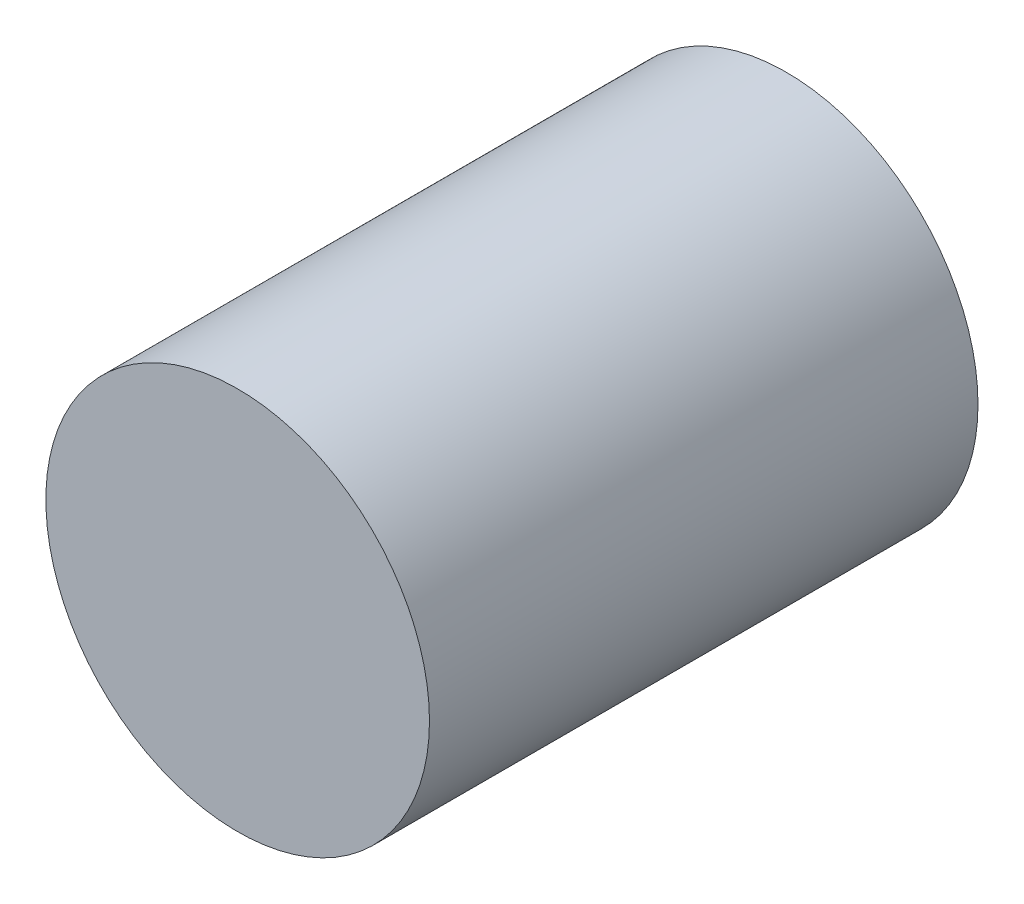
ISO-10303-21;
HEADER;
FILE_DESCRIPTION(('STEP AP214'),'2;1');
FILE_NAME('part.step','',(''),(''),'','','');
FILE_SCHEMA(('AUTOMOTIVE_DESIGN { 1 0 10303 214 1 1 1 1 }'));
ENDSEC;
DATA;
#1=APPLICATION_CONTEXT('core data for automotive mechanical design processes');
#2=APPLICATION_PROTOCOL_DEFINITION('international standard','automotive_design',2000,#1);
#3=PRODUCT_CONTEXT('',#1,'mechanical');
#4=PRODUCT('Part','Part','',(#3));
#5=PRODUCT_RELATED_PRODUCT_CATEGORY('part','',(#4));
#6=PRODUCT_DEFINITION_FORMATION('','',#4);
#7=PRODUCT_DEFINITION_CONTEXT('part definition',#1,'design');
#8=PRODUCT_DEFINITION('design','',#6,#7);
#9=PRODUCT_DEFINITION_SHAPE('','',#8);
#10=(LENGTH_UNIT() NAMED_UNIT(*) SI_UNIT(.MILLI.,.METRE.));
#11=(NAMED_UNIT(*) PLANE_ANGLE_UNIT() SI_UNIT($,.RADIAN.));
#12=(NAMED_UNIT(*) SI_UNIT($,.STERADIAN.) SOLID_ANGLE_UNIT());
#13=UNCERTAINTY_MEASURE_WITH_UNIT(LENGTH_MEASURE(1.E-05),#10,'distance_accuracy_value','');
#14=(GEOMETRIC_REPRESENTATION_CONTEXT(3) GLOBAL_UNCERTAINTY_ASSIGNED_CONTEXT((#13)) GLOBAL_UNIT_ASSIGNED_CONTEXT((#10,
#11,#12)) REPRESENTATION_CONTEXT('',''));
#15=CARTESIAN_POINT('',(0.,0.,0.));
#16=DIRECTION('',(0.,0.,1.));
#17=DIRECTION('',(1.,0.,0.));
#18=AXIS2_PLACEMENT_3D('',#15,#16,#17);
#19=CARTESIAN_POINT('',(-51.1263628648313,41.5168457570252,20.));
#20=DIRECTION('',(0.,0.,-1.));
#21=DIRECTION('',(-1.,0.,0.));
#22=AXIS2_PLACEMENT_3D('',#19,#20,#21);
#23=CYLINDRICAL_SURFACE('',#22,6.99411062752672);
#24=CARTESIAN_POINT('',(-51.1263628648313,41.5168457570252,20.));
#25=DIRECTION('',(0.,0.,1.));
#26=DIRECTION('',(1.,0.,0.));
#27=AXIS2_PLACEMENT_3D('',#24,#25,#26);
#28=CIRCLE('',#27,6.99411062752672);
#29=CARTESIAN_POINT('',(-44.1322522373046,41.5168457570252,20.));
#30=VERTEX_POINT('',#29);
#31=EDGE_CURVE('E10',#30,#30,#28,.T.);
#32=ORIENTED_EDGE('',*,*,#31,.F.);
#33=EDGE_LOOP('',(#32));
#34=FACE_BOUND('',#33,.T.);
#35=CARTESIAN_POINT('',(-51.1263628648313,41.5168457570252,0.));
#36=DIRECTION('',(0.,0.,1.));
#37=DIRECTION('',(1.,0.,0.));
#38=AXIS2_PLACEMENT_3D('',#35,#36,#37);
#39=CIRCLE('',#38,6.99411062752672);
#40=CARTESIAN_POINT('',(-44.1322522373046,41.5168457570252,0.));
#41=VERTEX_POINT('',#40);
#42=EDGE_CURVE('E34',#41,#41,#39,.T.);
#43=ORIENTED_EDGE('',*,*,#42,.T.);
#44=EDGE_LOOP('',(#43));
#45=FACE_BOUND('',#44,.T.);
#46=ADVANCED_FACE('F31',(#34,#45),#23,.T.);
#47=CARTESIAN_POINT('',(-51.1263628648313,41.5168457570252,20.));
#48=DIRECTION('',(0.,0.,1.));
#49=DIRECTION('',(1.,0.,0.));
#50=AXIS2_PLACEMENT_3D('',#47,#48,#49);
#51=PLANE('',#50);
#52=ORIENTED_EDGE('',*,*,#31,.T.);
#53=EDGE_LOOP('',(#52));
#54=FACE_BOUND('',#53,.T.);
#55=ADVANCED_FACE('F46',(#54),#51,.T.);
#56=CARTESIAN_POINT('',(-51.1263628648313,41.5168457570252,0.));
#57=DIRECTION('',(0.,0.,1.));
#58=DIRECTION('',(1.,0.,0.));
#59=AXIS2_PLACEMENT_3D('',#56,#57,#58);
#60=PLANE('',#59);
#61=ORIENTED_EDGE('',*,*,#42,.F.);
#62=EDGE_LOOP('',(#61));
#63=FACE_BOUND('',#62,.T.);
#64=ADVANCED_FACE('F44',(#63),#60,.F.);
#65=CLOSED_SHELL('',(#46,#55,#64));
#66=MANIFOLD_SOLID_BREP('B2',#65);
#67=ADVANCED_BREP_SHAPE_REPRESENTATION('',(#18,#66),#14);
#68=SHAPE_DEFINITION_REPRESENTATION(#9,#67);
ENDSEC;
END-ISO-10303-21;
